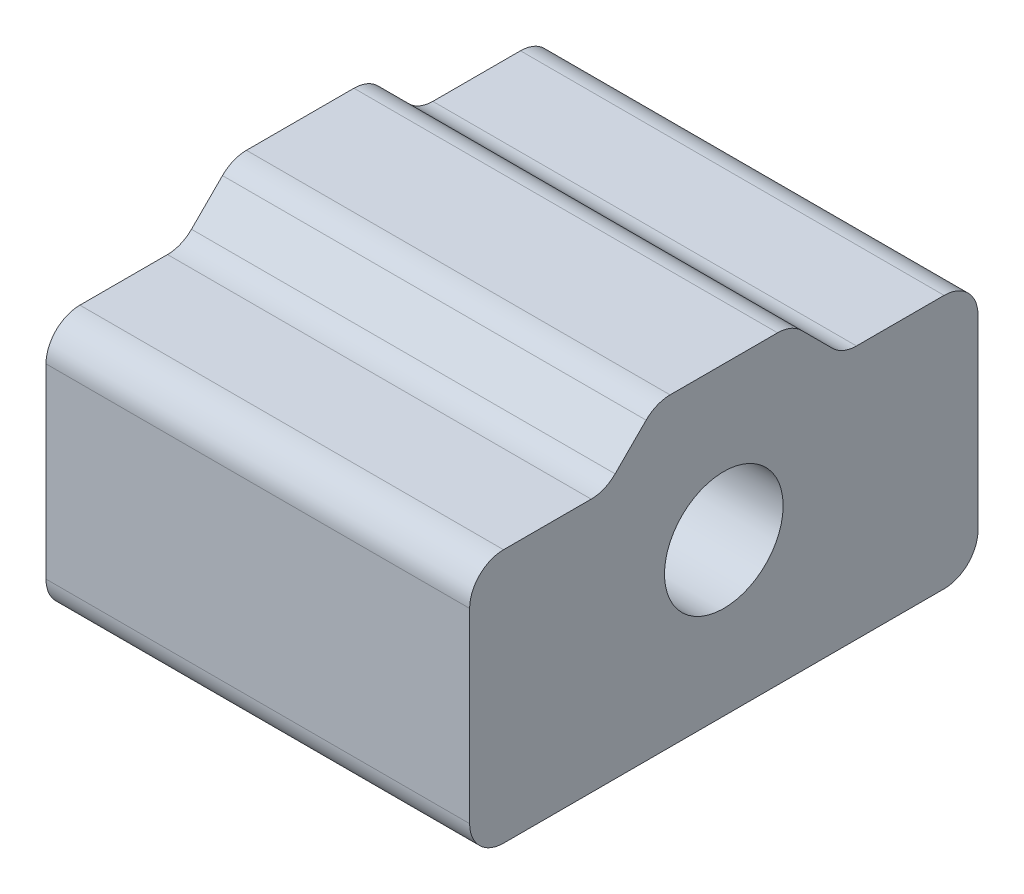
ISO-10303-21;
HEADER;
FILE_DESCRIPTION(('STEP AP214'),'2;1');
FILE_NAME('part.step','',(''),(''),'','','');
FILE_SCHEMA(('AUTOMOTIVE_DESIGN { 1 0 10303 214 1 1 1 1 }'));
ENDSEC;
DATA;
#1=APPLICATION_CONTEXT('core data for automotive mechanical design processes');
#2=APPLICATION_PROTOCOL_DEFINITION('international standard','automotive_design',2000,#1);
#3=PRODUCT_CONTEXT('',#1,'mechanical');
#4=PRODUCT('Part','Part','',(#3));
#5=PRODUCT_RELATED_PRODUCT_CATEGORY('part','',(#4));
#6=PRODUCT_DEFINITION_FORMATION('','',#4);
#7=PRODUCT_DEFINITION_CONTEXT('part definition',#1,'design');
#8=PRODUCT_DEFINITION('design','',#6,#7);
#9=PRODUCT_DEFINITION_SHAPE('','',#8);
#10=(LENGTH_UNIT() NAMED_UNIT(*) SI_UNIT(.MILLI.,.METRE.));
#11=(NAMED_UNIT(*) PLANE_ANGLE_UNIT() SI_UNIT($,.RADIAN.));
#12=(NAMED_UNIT(*) SI_UNIT($,.STERADIAN.) SOLID_ANGLE_UNIT());
#13=UNCERTAINTY_MEASURE_WITH_UNIT(LENGTH_MEASURE(1.E-05),#10,'distance_accuracy_value','');
#14=(GEOMETRIC_REPRESENTATION_CONTEXT(3) GLOBAL_UNCERTAINTY_ASSIGNED_CONTEXT((#13)) GLOBAL_UNIT_ASSIGNED_CONTEXT((#10,
#11,#12)) REPRESENTATION_CONTEXT('',''));
#15=CARTESIAN_POINT('',(0.,0.,0.));
#16=DIRECTION('',(0.,0.,1.));
#17=DIRECTION('',(1.,0.,0.));
#18=AXIS2_PLACEMENT_3D('',#15,#16,#17);
#19=CARTESIAN_POINT('',(-31.0580369710522,18.,-14.513593864228));
#20=DIRECTION('',(1.,0.,0.));
#21=DIRECTION('',(0.,0.,-1.));
#22=AXIS2_PLACEMENT_3D('',#19,#20,#21);
#23=PLANE('',#22);
#24=CARTESIAN_POINT('',(-31.0580369710522,9.,0.486406135772036));
#25=DIRECTION('',(1.,0.,0.));
#26=DIRECTION('',(0.,0.,-1.));
#27=AXIS2_PLACEMENT_3D('',#24,#25,#26);
#28=CIRCLE('',#27,3.5);
#29=CARTESIAN_POINT('',(-31.0580369710522,9.,-3.01359386422796));
#30=VERTEX_POINT('',#29);
#31=EDGE_CURVE('E326',#30,#30,#28,.T.);
#32=ORIENTED_EDGE('',*,*,#31,.T.);
#33=EDGE_LOOP('',(#32));
#34=FACE_BOUND('',#33,.T.);
#35=DIRECTION('',(0.,0.707106781186549,-0.707106781186546));
#36=VECTOR('',#35,1.);
#37=CARTESIAN_POINT('',(-31.0580369710522,27.5,-5.01359386422793));
#38=LINE('',#37,#36);
#39=CARTESIAN_POINT('',(-31.0580369710522,15.5857864376269,6.90061969814513));
#40=VERTEX_POINT('',#39);
#41=CARTESIAN_POINT('',(-31.0580369710522,17.4142135623731,5.07219257339895));
#42=VERTEX_POINT('',#41);
#43=EDGE_CURVE('E176',#40,#42,#38,.T.);
#44=ORIENTED_EDGE('',*,*,#43,.T.);
#45=CARTESIAN_POINT('',(-31.0580369710522,16.,3.65797901102585));
#46=DIRECTION('',(1.,0.,0.));
#47=DIRECTION('',(0.,0.,-1.));
#48=AXIS2_PLACEMENT_3D('',#45,#46,#47);
#49=CIRCLE('',#48,2.);
#50=CARTESIAN_POINT('',(-31.0580369710522,18.,3.65797901102585));
#51=VERTEX_POINT('',#50);
#52=EDGE_CURVE('E245',#42,#51,#49,.F.);
#53=ORIENTED_EDGE('',*,*,#52,.T.);
#54=DIRECTION('',(0.,0.,1.));
#55=VECTOR('',#54,1.);
#56=CARTESIAN_POINT('',(-31.0580369710522,18.,-14.513593864228));
#57=LINE('',#56,#55);
#58=CARTESIAN_POINT('',(-31.0580369710522,18.,-2.68516673948174));
#59=VERTEX_POINT('',#58);
#60=EDGE_CURVE('E200',#59,#51,#57,.T.);
#61=ORIENTED_EDGE('',*,*,#60,.F.);
#62=CARTESIAN_POINT('',(-31.0580369710522,16.,-2.68516673948174));
#63=DIRECTION('',(1.,0.,0.));
#64=DIRECTION('',(0.,0.,-1.));
#65=AXIS2_PLACEMENT_3D('',#62,#63,#64);
#66=CIRCLE('',#65,2.);
#67=CARTESIAN_POINT('',(-31.0580369710522,17.4142135623731,-4.09938030185483));
#68=VERTEX_POINT('',#67);
#69=EDGE_CURVE('E230',#59,#68,#66,.F.);
#70=ORIENTED_EDGE('',*,*,#69,.T.);
#71=DIRECTION('',(0.,-0.707106781186544,-0.707106781186551));
#72=VECTOR('',#71,1.);
#73=CARTESIAN_POINT('',(-31.0580369710522,12.5,-9.013593864228));
#74=LINE('',#73,#72);
#75=CARTESIAN_POINT('',(-31.0580369710522,15.5857864376269,-5.92780742660106));
#76=VERTEX_POINT('',#75);
#77=EDGE_CURVE('E334',#68,#76,#74,.T.);
#78=ORIENTED_EDGE('',*,*,#77,.T.);
#79=CARTESIAN_POINT('',(-31.0580369710522,17.,-7.34202098897415));
#80=DIRECTION('',(1.,0.,0.));
#81=DIRECTION('',(0.,0.,-1.));
#82=AXIS2_PLACEMENT_3D('',#79,#80,#81);
#83=CIRCLE('',#82,2.);
#84=CARTESIAN_POINT('',(-31.0580369710522,15.,-7.34202098897415));
#85=VERTEX_POINT('',#84);
#86=EDGE_CURVE('E11',#76,#85,#83,.T.);
#87=ORIENTED_EDGE('',*,*,#86,.T.);
#88=DIRECTION('',(0.,0.,-1.));
#89=VECTOR('',#88,1.);
#90=CARTESIAN_POINT('',(-31.0580369710522,15.,-14.513593864228));
#91=LINE('',#90,#89);
#92=CARTESIAN_POINT('',(-31.0580369710522,15.,-12.513593864228));
#93=VERTEX_POINT('',#92);
#94=EDGE_CURVE('E192',#85,#93,#91,.T.);
#95=ORIENTED_EDGE('',*,*,#94,.T.);
#96=CARTESIAN_POINT('',(-31.0580369710522,13.,-12.513593864228));
#97=DIRECTION('',(1.,0.,0.));
#98=DIRECTION('',(0.,0.,-1.));
#99=AXIS2_PLACEMENT_3D('',#96,#97,#98);
#100=CIRCLE('',#99,2.);
#101=CARTESIAN_POINT('',(-31.0580369710522,13.,-14.513593864228));
#102=VERTEX_POINT('',#101);
#103=EDGE_CURVE('E233',#93,#102,#100,.F.);
#104=ORIENTED_EDGE('',*,*,#103,.T.);
#105=DIRECTION('',(0.,-1.,0.));
#106=VECTOR('',#105,1.);
#107=CARTESIAN_POINT('',(-31.0580369710522,18.,-14.513593864228));
#108=LINE('',#107,#106);
#109=CARTESIAN_POINT('',(-31.0580369710522,2.,-14.513593864228));
#110=VERTEX_POINT('',#109);
#111=EDGE_CURVE('E209',#102,#110,#108,.T.);
#112=ORIENTED_EDGE('',*,*,#111,.T.);
#113=CARTESIAN_POINT('',(-31.0580369710522,2.,-12.513593864228));
#114=DIRECTION('',(1.,0.,0.));
#115=DIRECTION('',(0.,0.,-1.));
#116=AXIS2_PLACEMENT_3D('',#113,#114,#115);
#117=CIRCLE('',#116,2.);
#118=CARTESIAN_POINT('',(-31.0580369710522,0.,-12.513593864228));
#119=VERTEX_POINT('',#118);
#120=EDGE_CURVE('E236',#110,#119,#117,.F.);
#121=ORIENTED_EDGE('',*,*,#120,.T.);
#122=DIRECTION('',(0.,0.,1.));
#123=VECTOR('',#122,1.);
#124=CARTESIAN_POINT('',(-31.0580369710522,0.,-14.513593864228));
#125=LINE('',#124,#123);
#126=CARTESIAN_POINT('',(-31.0580369710522,0.,13.486406135772));
#127=VERTEX_POINT('',#126);
#128=EDGE_CURVE('E199',#119,#127,#125,.T.);
#129=ORIENTED_EDGE('',*,*,#128,.T.);
#130=CARTESIAN_POINT('',(-31.0580369710522,2.,13.486406135772));
#131=DIRECTION('',(1.,0.,0.));
#132=DIRECTION('',(0.,0.,-1.));
#133=AXIS2_PLACEMENT_3D('',#130,#131,#132);
#134=CIRCLE('',#133,2.);
#135=CARTESIAN_POINT('',(-31.0580369710522,2.,15.486406135772));
#136=VERTEX_POINT('',#135);
#137=EDGE_CURVE('E239',#127,#136,#134,.F.);
#138=ORIENTED_EDGE('',*,*,#137,.T.);
#139=DIRECTION('',(0.,-1.,0.));
#140=VECTOR('',#139,1.);
#141=CARTESIAN_POINT('',(-31.0580369710522,18.,15.486406135772));
#142=LINE('',#141,#140);
#143=CARTESIAN_POINT('',(-31.0580369710522,13.,15.486406135772));
#144=VERTEX_POINT('',#143);
#145=EDGE_CURVE('E179',#144,#136,#142,.T.);
#146=ORIENTED_EDGE('',*,*,#145,.F.);
#147=CARTESIAN_POINT('',(-31.0580369710522,13.,13.486406135772));
#148=DIRECTION('',(1.,0.,0.));
#149=DIRECTION('',(0.,0.,-1.));
#150=AXIS2_PLACEMENT_3D('',#147,#148,#149);
#151=CIRCLE('',#150,2.);
#152=CARTESIAN_POINT('',(-31.0580369710522,15.,13.486406135772));
#153=VERTEX_POINT('',#152);
#154=EDGE_CURVE('E242',#144,#153,#151,.F.);
#155=ORIENTED_EDGE('',*,*,#154,.T.);
#156=DIRECTION('',(0.,0.,-1.));
#157=VECTOR('',#156,1.);
#158=CARTESIAN_POINT('',(-31.0580369710522,15.,-14.513593864228));
#159=LINE('',#158,#157);
#160=CARTESIAN_POINT('',(-31.0580369710522,15.,8.31483326051823));
#161=VERTEX_POINT('',#160);
#162=EDGE_CURVE('E190',#153,#161,#159,.T.);
#163=ORIENTED_EDGE('',*,*,#162,.T.);
#164=CARTESIAN_POINT('',(-31.0580369710522,17.,8.31483326051823));
#165=DIRECTION('',(1.,0.,0.));
#166=DIRECTION('',(0.,0.,-1.));
#167=AXIS2_PLACEMENT_3D('',#164,#165,#166);
#168=CIRCLE('',#167,2.);
#169=EDGE_CURVE('E165',#161,#40,#168,.T.);
#170=ORIENTED_EDGE('',*,*,#169,.T.);
#171=EDGE_LOOP('',(#44,#53,#61,#70,#78,#87,#95,#104,#112,#121,#129,#138,#146,#155,#163,#170));
#172=FACE_BOUND('',#171,.T.);
#173=ADVANCED_FACE('F41',(#34,#172),#23,.F.);
#174=CARTESIAN_POINT('',(-31.0580369710522,18.,15.486406135772));
#175=DIRECTION('',(0.,0.,-1.));
#176=DIRECTION('',(-1.,0.,0.));
#177=AXIS2_PLACEMENT_3D('',#174,#175,#176);
#178=PLANE('',#177);
#179=DIRECTION('',(0.,-1.,0.));
#180=VECTOR('',#179,1.);
#181=CARTESIAN_POINT('',(-6.05803697105218,18.,15.486406135772));
#182=LINE('',#181,#180);
#183=CARTESIAN_POINT('',(-6.05803697105218,13.,15.486406135772));
#184=VERTEX_POINT('',#183);
#185=CARTESIAN_POINT('',(-6.05803697105218,2.,15.486406135772));
#186=VERTEX_POINT('',#185);
#187=EDGE_CURVE('E222',#184,#186,#182,.T.);
#188=ORIENTED_EDGE('',*,*,#187,.F.);
#189=DIRECTION('',(1.,0.,0.));
#190=VECTOR('',#189,1.);
#191=CARTESIAN_POINT('',(-31.0580369710522,13.,15.486406135772));
#192=LINE('',#191,#190);
#193=EDGE_CURVE('E280',#184,#144,#192,.F.);
#194=ORIENTED_EDGE('',*,*,#193,.T.);
#195=ORIENTED_EDGE('',*,*,#145,.T.);
#196=DIRECTION('',(1.,0.,0.));
#197=VECTOR('',#196,1.);
#198=CARTESIAN_POINT('',(-31.0580369710522,2.,15.486406135772));
#199=LINE('',#198,#197);
#200=EDGE_CURVE('E276',#136,#186,#199,.T.);
#201=ORIENTED_EDGE('',*,*,#200,.T.);
#202=EDGE_LOOP('',(#188,#194,#195,#201));
#203=FACE_BOUND('',#202,.T.);
#204=ADVANCED_FACE('F411',(#203),#178,.F.);
#205=CARTESIAN_POINT('',(-6.05803697105218,18.,-14.513593864228));
#206=DIRECTION('',(-1.,0.,0.));
#207=DIRECTION('',(0.,0.,1.));
#208=AXIS2_PLACEMENT_3D('',#205,#206,#207);
#209=PLANE('',#208);
#210=CARTESIAN_POINT('',(-6.05803697105218,9.,0.486406135772033));
#211=DIRECTION('',(1.,0.,0.));
#212=DIRECTION('',(0.,0.,-1.));
#213=AXIS2_PLACEMENT_3D('',#210,#211,#212);
#214=CIRCLE('',#213,3.5);
#215=CARTESIAN_POINT('',(-6.05803697105218,9.,-3.01359386422796));
#216=VERTEX_POINT('',#215);
#217=EDGE_CURVE('E347',#216,#216,#214,.T.);
#218=ORIENTED_EDGE('',*,*,#217,.F.);
#219=EDGE_LOOP('',(#218));
#220=FACE_BOUND('',#219,.T.);
#221=DIRECTION('',(0.,0.,-1.));
#222=VECTOR('',#221,1.);
#223=CARTESIAN_POINT('',(-6.05803697105218,18.,-14.513593864228));
#224=LINE('',#223,#222);
#225=CARTESIAN_POINT('',(-6.05803697105218,18.,3.65797901102585));
#226=VERTEX_POINT('',#225);
#227=CARTESIAN_POINT('',(-6.05803697105218,18.,-2.68516673948175));
#228=VERTEX_POINT('',#227);
#229=EDGE_CURVE('E204',#226,#228,#224,.T.);
#230=ORIENTED_EDGE('',*,*,#229,.F.);
#231=CARTESIAN_POINT('',(-6.05803697105218,16.,3.65797901102585));
#232=DIRECTION('',(-1.,0.,0.));
#233=DIRECTION('',(0.,0.,1.));
#234=AXIS2_PLACEMENT_3D('',#231,#232,#233);
#235=CIRCLE('',#234,2.);
#236=CARTESIAN_POINT('',(-6.05803697105218,17.4142135623731,5.07219257339895));
#237=VERTEX_POINT('',#236);
#238=EDGE_CURVE('E184',#226,#237,#235,.F.);
#239=ORIENTED_EDGE('',*,*,#238,.T.);
#240=DIRECTION('',(0.,0.707106781186549,-0.707106781186546));
#241=VECTOR('',#240,1.);
#242=CARTESIAN_POINT('',(-6.05803697105218,11.243203067886,11.243203067886));
#243=LINE('',#242,#241);
#244=CARTESIAN_POINT('',(-6.05803697105218,15.5857864376269,6.90061969814513));
#245=VERTEX_POINT('',#244);
#246=EDGE_CURVE('E173',#245,#237,#243,.T.);
#247=ORIENTED_EDGE('',*,*,#246,.F.);
#248=CARTESIAN_POINT('',(-6.05803697105218,17.,8.31483326051823));
#249=DIRECTION('',(-1.,0.,0.));
#250=DIRECTION('',(0.,0.,1.));
#251=AXIS2_PLACEMENT_3D('',#248,#249,#250);
#252=CIRCLE('',#251,2.);
#253=CARTESIAN_POINT('',(-6.05803697105218,15.,8.31483326051823));
#254=VERTEX_POINT('',#253);
#255=EDGE_CURVE('E155',#245,#254,#252,.T.);
#256=ORIENTED_EDGE('',*,*,#255,.T.);
#257=DIRECTION('',(0.,0.,-1.));
#258=VECTOR('',#257,1.);
#259=CARTESIAN_POINT('',(-6.05803697105218,15.,0.));
#260=LINE('',#259,#258);
#261=CARTESIAN_POINT('',(-6.05803697105218,15.,13.486406135772));
#262=VERTEX_POINT('',#261);
#263=EDGE_CURVE('E186',#262,#254,#260,.T.);
#264=ORIENTED_EDGE('',*,*,#263,.F.);
#265=CARTESIAN_POINT('',(-6.05803697105218,13.,13.486406135772));
#266=DIRECTION('',(-1.,0.,0.));
#267=DIRECTION('',(0.,0.,1.));
#268=AXIS2_PLACEMENT_3D('',#265,#266,#267);
#269=CIRCLE('',#268,2.);
#270=EDGE_CURVE('E265',#262,#184,#269,.F.);
#271=ORIENTED_EDGE('',*,*,#270,.T.);
#272=ORIENTED_EDGE('',*,*,#187,.T.);
#273=CARTESIAN_POINT('',(-6.05803697105218,2.,13.486406135772));
#274=DIRECTION('',(-1.,0.,0.));
#275=DIRECTION('',(0.,0.,1.));
#276=AXIS2_PLACEMENT_3D('',#273,#274,#275);
#277=CIRCLE('',#276,2.);
#278=CARTESIAN_POINT('',(-6.05803697105218,0.,13.486406135772));
#279=VERTEX_POINT('',#278);
#280=EDGE_CURVE('E64',#186,#279,#277,.F.);
#281=ORIENTED_EDGE('',*,*,#280,.T.);
#282=DIRECTION('',(0.,0.,-1.));
#283=VECTOR('',#282,1.);
#284=CARTESIAN_POINT('',(-6.05803697105218,0.,-14.513593864228));
#285=LINE('',#284,#283);
#286=CARTESIAN_POINT('',(-6.05803697105218,0.,-12.513593864228));
#287=VERTEX_POINT('',#286);
#288=EDGE_CURVE('E205',#279,#287,#285,.T.);
#289=ORIENTED_EDGE('',*,*,#288,.T.);
#290=CARTESIAN_POINT('',(-6.05803697105218,2.,-12.513593864228));
#291=DIRECTION('',(-1.,0.,0.));
#292=DIRECTION('',(0.,0.,1.));
#293=AXIS2_PLACEMENT_3D('',#290,#291,#292);
#294=CIRCLE('',#293,2.);
#295=CARTESIAN_POINT('',(-6.05803697105218,2.,-14.513593864228));
#296=VERTEX_POINT('',#295);
#297=EDGE_CURVE('E260',#287,#296,#294,.F.);
#298=ORIENTED_EDGE('',*,*,#297,.T.);
#299=DIRECTION('',(0.,-1.,0.));
#300=VECTOR('',#299,1.);
#301=CARTESIAN_POINT('',(-6.05803697105218,18.,-14.513593864228));
#302=LINE('',#301,#300);
#303=CARTESIAN_POINT('',(-6.05803697105218,13.,-14.513593864228));
#304=VERTEX_POINT('',#303);
#305=EDGE_CURVE('E218',#304,#296,#302,.T.);
#306=ORIENTED_EDGE('',*,*,#305,.F.);
#307=CARTESIAN_POINT('',(-6.05803697105218,13.,-12.513593864228));
#308=DIRECTION('',(-1.,0.,0.));
#309=DIRECTION('',(0.,0.,1.));
#310=AXIS2_PLACEMENT_3D('',#307,#308,#309);
#311=CIRCLE('',#310,2.);
#312=CARTESIAN_POINT('',(-6.05803697105218,15.,-12.513593864228));
#313=VERTEX_POINT('',#312);
#314=EDGE_CURVE('E257',#304,#313,#311,.F.);
#315=ORIENTED_EDGE('',*,*,#314,.T.);
#316=DIRECTION('',(0.,0.,-1.));
#317=VECTOR('',#316,1.);
#318=CARTESIAN_POINT('',(-6.05803697105218,15.,-14.513593864228));
#319=LINE('',#318,#317);
#320=CARTESIAN_POINT('',(-6.05803697105218,15.,-7.34202098897415));
#321=VERTEX_POINT('',#320);
#322=EDGE_CURVE('E316',#321,#313,#319,.T.);
#323=ORIENTED_EDGE('',*,*,#322,.F.);
#324=CARTESIAN_POINT('',(-6.05803697105219,17.,-7.34202098897415));
#325=DIRECTION('',(-1.,0.,0.));
#326=DIRECTION('',(0.,0.,1.));
#327=AXIS2_PLACEMENT_3D('',#324,#325,#326);
#328=CIRCLE('',#327,2.);
#329=CARTESIAN_POINT('',(-6.05803697105218,15.5857864376269,-5.92780742660106));
#330=VERTEX_POINT('',#329);
#331=EDGE_CURVE('E50',#321,#330,#328,.T.);
#332=ORIENTED_EDGE('',*,*,#331,.T.);
#333=DIRECTION('',(0.,-0.707106781186544,-0.707106781186551));
#334=VECTOR('',#333,1.);
#335=CARTESIAN_POINT('',(-6.05803697105218,18.,-3.51359386422793));
#336=LINE('',#335,#334);
#337=CARTESIAN_POINT('',(-6.05803697105218,17.4142135623731,-4.09938030185483));
#338=VERTEX_POINT('',#337);
#339=EDGE_CURVE('E314',#338,#330,#336,.T.);
#340=ORIENTED_EDGE('',*,*,#339,.F.);
#341=CARTESIAN_POINT('',(-6.05803697105218,16.,-2.68516673948175));
#342=DIRECTION('',(-1.,0.,0.));
#343=DIRECTION('',(0.,0.,1.));
#344=AXIS2_PLACEMENT_3D('',#341,#342,#343);
#345=CIRCLE('',#344,2.);
#346=EDGE_CURVE('E254',#338,#228,#345,.F.);
#347=ORIENTED_EDGE('',*,*,#346,.T.);
#348=EDGE_LOOP('',(#230,#239,#247,#256,#264,#271,#272,#281,#289,#298,#306,#315,#323,#332,#340,#347));
#349=FACE_BOUND('',#348,.T.);
#350=ADVANCED_FACE('F182',(#220,#349),#209,.F.);
#351=CARTESIAN_POINT('',(-31.0580369710522,18.,-14.513593864228));
#352=DIRECTION('',(0.,0.,1.));
#353=DIRECTION('',(1.,0.,0.));
#354=AXIS2_PLACEMENT_3D('',#351,#352,#353);
#355=PLANE('',#354);
#356=ORIENTED_EDGE('',*,*,#305,.T.);
#357=DIRECTION('',(-1.,0.,0.));
#358=VECTOR('',#357,1.);
#359=CARTESIAN_POINT('',(-31.0580369710522,2.,-14.513593864228));
#360=LINE('',#359,#358);
#361=EDGE_CURVE('E292',#296,#110,#360,.T.);
#362=ORIENTED_EDGE('',*,*,#361,.T.);
#363=ORIENTED_EDGE('',*,*,#111,.F.);
#364=DIRECTION('',(1.,0.,0.));
#365=VECTOR('',#364,1.);
#366=CARTESIAN_POINT('',(-31.0580369710522,13.,-14.513593864228));
#367=LINE('',#366,#365);
#368=EDGE_CURVE('E288',#102,#304,#367,.T.);
#369=ORIENTED_EDGE('',*,*,#368,.T.);
#370=EDGE_LOOP('',(#356,#362,#363,#369));
#371=FACE_BOUND('',#370,.T.);
#372=ADVANCED_FACE('F465',(#371),#355,.F.);
#373=CARTESIAN_POINT('',(0.,18.,0.));
#374=DIRECTION('',(0.,1.,0.));
#375=DIRECTION('',(0.,0.,1.));
#376=AXIS2_PLACEMENT_3D('',#373,#374,#375);
#377=PLANE('',#376);
#378=ORIENTED_EDGE('',*,*,#60,.T.);
#379=DIRECTION('',(-1.,0.,0.));
#380=VECTOR('',#379,1.);
#381=CARTESIAN_POINT('',(-6.05803697105218,18.,3.65797901102585));
#382=LINE('',#381,#380);
#383=EDGE_CURVE('E251',#51,#226,#382,.F.);
#384=ORIENTED_EDGE('',*,*,#383,.T.);
#385=ORIENTED_EDGE('',*,*,#229,.T.);
#386=DIRECTION('',(1.,0.,0.));
#387=VECTOR('',#386,1.);
#388=CARTESIAN_POINT('',(-31.0580369710522,18.,-2.68516673948174));
#389=LINE('',#388,#387);
#390=EDGE_CURVE('E248',#228,#59,#389,.F.);
#391=ORIENTED_EDGE('',*,*,#390,.T.);
#392=EDGE_LOOP('',(#378,#384,#385,#391));
#393=FACE_BOUND('',#392,.T.);
#394=ADVANCED_FACE('F397',(#393),#377,.T.);
#395=CARTESIAN_POINT('',(0.,0.,0.));
#396=DIRECTION('',(0.,1.,0.));
#397=DIRECTION('',(0.,0.,1.));
#398=AXIS2_PLACEMENT_3D('',#395,#396,#397);
#399=PLANE('',#398);
#400=CARTESIAN_POINT('',(-11.0580369710522,0.,-9.51359386422797));
#401=DIRECTION('',(0.,-1.,0.));
#402=DIRECTION('',(0.,0.,-1.));
#403=AXIS2_PLACEMENT_3D('',#400,#401,#402);
#404=CIRCLE('',#403,2.);
#405=CARTESIAN_POINT('',(-11.0580369710522,0.,-11.513593864228));
#406=VERTEX_POINT('',#405);
#407=EDGE_CURVE('E369',#406,#406,#404,.T.);
#408=ORIENTED_EDGE('',*,*,#407,.F.);
#409=EDGE_LOOP('',(#408));
#410=FACE_BOUND('',#409,.T.);
#411=CARTESIAN_POINT('',(-26.0580369710522,0.,10.486406135772));
#412=DIRECTION('',(0.,-1.,0.));
#413=DIRECTION('',(0.,0.,-1.));
#414=AXIS2_PLACEMENT_3D('',#411,#412,#413);
#415=CIRCLE('',#414,2.);
#416=CARTESIAN_POINT('',(-26.0580369710522,0.,8.48640613577203));
#417=VERTEX_POINT('',#416);
#418=EDGE_CURVE('E360',#417,#417,#415,.T.);
#419=ORIENTED_EDGE('',*,*,#418,.F.);
#420=EDGE_LOOP('',(#419));
#421=FACE_BOUND('',#420,.T.);
#422=CARTESIAN_POINT('',(-26.0580369710522,0.,-9.51359386422797));
#423=DIRECTION('',(0.,-1.,0.));
#424=DIRECTION('',(0.,0.,-1.));
#425=AXIS2_PLACEMENT_3D('',#422,#423,#424);
#426=CIRCLE('',#425,2.);
#427=CARTESIAN_POINT('',(-26.0580369710522,0.,-11.513593864228));
#428=VERTEX_POINT('',#427);
#429=EDGE_CURVE('E376',#428,#428,#426,.T.);
#430=ORIENTED_EDGE('',*,*,#429,.F.);
#431=EDGE_LOOP('',(#430));
#432=FACE_BOUND('',#431,.T.);
#433=CARTESIAN_POINT('',(-11.0580369710522,0.,10.486406135772));
#434=DIRECTION('',(0.,-1.,0.));
#435=DIRECTION('',(0.,0.,-1.));
#436=AXIS2_PLACEMENT_3D('',#433,#434,#435);
#437=CIRCLE('',#436,2.);
#438=CARTESIAN_POINT('',(-11.0580369710522,0.,8.48640613577203));
#439=VERTEX_POINT('',#438);
#440=EDGE_CURVE('E352',#439,#439,#437,.T.);
#441=ORIENTED_EDGE('',*,*,#440,.F.);
#442=EDGE_LOOP('',(#441));
#443=FACE_BOUND('',#442,.T.);
#444=ORIENTED_EDGE('',*,*,#288,.F.);
#445=DIRECTION('',(1.,0.,0.));
#446=VECTOR('',#445,1.);
#447=CARTESIAN_POINT('',(0.,0.,13.486406135772));
#448=LINE('',#447,#446);
#449=EDGE_CURVE('E285',#279,#127,#448,.F.);
#450=ORIENTED_EDGE('',*,*,#449,.T.);
#451=ORIENTED_EDGE('',*,*,#128,.F.);
#452=DIRECTION('',(-1.,0.,0.));
#453=VECTOR('',#452,1.);
#454=CARTESIAN_POINT('',(0.,0.,-12.513593864228));
#455=LINE('',#454,#453);
#456=EDGE_CURVE('E57',#119,#287,#455,.F.);
#457=ORIENTED_EDGE('',*,*,#456,.T.);
#458=EDGE_LOOP('',(#444,#450,#451,#457));
#459=FACE_BOUND('',#458,.T.);
#460=ADVANCED_FACE('F393',(#410,#421,#432,#443,#459),#399,.F.);
#461=CARTESIAN_POINT('',(-39.0580369710522,15.,0.));
#462=DIRECTION('',(0.,-1.,0.));
#463=DIRECTION('',(0.,0.,-1.));
#464=AXIS2_PLACEMENT_3D('',#461,#462,#463);
#465=PLANE('',#464);
#466=ORIENTED_EDGE('',*,*,#263,.T.);
#467=DIRECTION('',(1.,0.,0.));
#468=VECTOR('',#467,1.);
#469=CARTESIAN_POINT('',(-31.0580369710522,15.,8.31483326051823));
#470=LINE('',#469,#468);
#471=EDGE_CURVE('E160',#254,#161,#470,.F.);
#472=ORIENTED_EDGE('',*,*,#471,.T.);
#473=ORIENTED_EDGE('',*,*,#162,.F.);
#474=DIRECTION('',(1.,0.,0.));
#475=VECTOR('',#474,1.);
#476=CARTESIAN_POINT('',(-39.0580369710522,15.,13.486406135772));
#477=LINE('',#476,#475);
#478=EDGE_CURVE('E270',#153,#262,#477,.T.);
#479=ORIENTED_EDGE('',*,*,#478,.T.);
#480=EDGE_LOOP('',(#466,#472,#473,#479));
#481=FACE_BOUND('',#480,.T.);
#482=ADVANCED_FACE('F396',(#481),#465,.F.);
#483=CARTESIAN_POINT('',(-39.0580369710522,11.243203067886,11.243203067886));
#484=DIRECTION('',(0.,-0.707106781186546,-0.707106781186549));
#485=DIRECTION('',(0.,0.707106781186549,-0.707106781186546));
#486=AXIS2_PLACEMENT_3D('',#483,#484,#485);
#487=PLANE('',#486);
#488=ORIENTED_EDGE('',*,*,#246,.T.);
#489=DIRECTION('',(-1.,0.,0.));
#490=VECTOR('',#489,1.);
#491=CARTESIAN_POINT('',(-31.0580369710522,17.4142135623731,5.07219257339895));
#492=LINE('',#491,#490);
#493=EDGE_CURVE('E178',#237,#42,#492,.T.);
#494=ORIENTED_EDGE('',*,*,#493,.T.);
#495=ORIENTED_EDGE('',*,*,#43,.F.);
#496=DIRECTION('',(1.,0.,0.));
#497=VECTOR('',#496,1.);
#498=CARTESIAN_POINT('',(-6.05803697105218,15.5857864376269,6.90061969814513));
#499=LINE('',#498,#497);
#500=EDGE_CURVE('E159',#40,#245,#499,.T.);
#501=ORIENTED_EDGE('',*,*,#500,.T.);
#502=EDGE_LOOP('',(#488,#494,#495,#501));
#503=FACE_BOUND('',#502,.T.);
#504=ADVANCED_FACE('F171',(#503),#487,.F.);
#505=CARTESIAN_POINT('',(-39.0580369710522,15.,-14.513593864228));
#506=DIRECTION('',(0.,-1.,0.));
#507=DIRECTION('',(0.,0.,-1.));
#508=AXIS2_PLACEMENT_3D('',#505,#506,#507);
#509=PLANE('',#508);
#510=ORIENTED_EDGE('',*,*,#322,.T.);
#511=DIRECTION('',(1.,0.,0.));
#512=VECTOR('',#511,1.);
#513=CARTESIAN_POINT('',(-39.0580369710522,15.,-12.513593864228));
#514=LINE('',#513,#512);
#515=EDGE_CURVE('E300',#313,#93,#514,.F.);
#516=ORIENTED_EDGE('',*,*,#515,.T.);
#517=ORIENTED_EDGE('',*,*,#94,.F.);
#518=DIRECTION('',(1.,0.,0.));
#519=VECTOR('',#518,1.);
#520=CARTESIAN_POINT('',(-6.05803697105218,15.,-7.34202098897415));
#521=LINE('',#520,#519);
#522=EDGE_CURVE('E296',#85,#321,#521,.T.);
#523=ORIENTED_EDGE('',*,*,#522,.T.);
#524=EDGE_LOOP('',(#510,#516,#517,#523));
#525=FACE_BOUND('',#524,.T.);
#526=ADVANCED_FACE('F336',(#525),#509,.F.);
#527=CARTESIAN_POINT('',(-39.0580369710522,18.,-3.51359386422793));
#528=DIRECTION('',(0.,-0.707106781186551,0.707106781186544));
#529=DIRECTION('',(0.,-0.707106781186544,-0.707106781186551));
#530=AXIS2_PLACEMENT_3D('',#527,#528,#529);
#531=PLANE('',#530);
#532=ORIENTED_EDGE('',*,*,#339,.T.);
#533=DIRECTION('',(1.,0.,0.));
#534=VECTOR('',#533,1.);
#535=CARTESIAN_POINT('',(-31.0580369710522,15.5857864376269,-5.92780742660106));
#536=LINE('',#535,#534);
#537=EDGE_CURVE('E166',#330,#76,#536,.F.);
#538=ORIENTED_EDGE('',*,*,#537,.T.);
#539=ORIENTED_EDGE('',*,*,#77,.F.);
#540=DIRECTION('',(1.,0.,0.));
#541=VECTOR('',#540,1.);
#542=CARTESIAN_POINT('',(-6.05803697105218,17.4142135623731,-4.09938030185484));
#543=LINE('',#542,#541);
#544=EDGE_CURVE('E303',#68,#338,#543,.T.);
#545=ORIENTED_EDGE('',*,*,#544,.T.);
#546=EDGE_LOOP('',(#532,#538,#539,#545));
#547=FACE_BOUND('',#546,.T.);
#548=ADVANCED_FACE('F321',(#547),#531,.F.);
#549=CARTESIAN_POINT('',(-39.0580369710522,9.,0.486406135772037));
#550=DIRECTION('',(1.,0.,0.));
#551=DIRECTION('',(0.,0.,-1.));
#552=AXIS2_PLACEMENT_3D('',#549,#550,#551);
#553=CYLINDRICAL_SURFACE('',#552,3.5);
#554=ORIENTED_EDGE('',*,*,#217,.T.);
#555=EDGE_LOOP('',(#554));
#556=FACE_BOUND('',#555,.T.);
#557=ORIENTED_EDGE('',*,*,#31,.F.);
#558=EDGE_LOOP('',(#557));
#559=FACE_BOUND('',#558,.T.);
#560=ADVANCED_FACE('F477',(#556,#559),#553,.F.);
#561=CARTESIAN_POINT('',(-11.0580369710522,6.,10.486406135772));
#562=DIRECTION('',(0.,-1.,0.));
#563=DIRECTION('',(0.,0.,-1.));
#564=AXIS2_PLACEMENT_3D('',#561,#562,#563);
#565=CYLINDRICAL_SURFACE('',#564,2.);
#566=CARTESIAN_POINT('',(-11.0580369710522,6.,10.486406135772));
#567=DIRECTION('',(0.,-1.,0.));
#568=DIRECTION('',(0.,0.,-1.));
#569=AXIS2_PLACEMENT_3D('',#566,#567,#568);
#570=CIRCLE('',#569,2.);
#571=CARTESIAN_POINT('',(-11.0580369710522,6.,8.48640613577203));
#572=VERTEX_POINT('',#571);
#573=EDGE_CURVE('E351',#572,#572,#570,.T.);
#574=ORIENTED_EDGE('',*,*,#573,.F.);
#575=EDGE_LOOP('',(#574));
#576=FACE_BOUND('',#575,.T.);
#577=ORIENTED_EDGE('',*,*,#440,.T.);
#578=EDGE_LOOP('',(#577));
#579=FACE_BOUND('',#578,.T.);
#580=ADVANCED_FACE('F480',(#576,#579),#565,.F.);
#581=CARTESIAN_POINT('',(-11.0580369710522,6.,10.486406135772));
#582=DIRECTION('',(0.,-1.,0.));
#583=DIRECTION('',(0.,0.,-1.));
#584=AXIS2_PLACEMENT_3D('',#581,#582,#583);
#585=PLANE('',#584);
#586=ORIENTED_EDGE('',*,*,#573,.T.);
#587=EDGE_LOOP('',(#586));
#588=FACE_BOUND('',#587,.T.);
#589=ADVANCED_FACE('F389',(#588),#585,.T.);
#590=CARTESIAN_POINT('',(-26.0580369710522,6.,-9.51359386422797));
#591=DIRECTION('',(0.,-1.,0.));
#592=DIRECTION('',(0.,0.,-1.));
#593=AXIS2_PLACEMENT_3D('',#590,#591,#592);
#594=CYLINDRICAL_SURFACE('',#593,2.);
#595=CARTESIAN_POINT('',(-26.0580369710522,6.,-9.51359386422797));
#596=DIRECTION('',(0.,-1.,0.));
#597=DIRECTION('',(0.,0.,-1.));
#598=AXIS2_PLACEMENT_3D('',#595,#596,#597);
#599=CIRCLE('',#598,2.);
#600=CARTESIAN_POINT('',(-26.0580369710522,6.,-11.513593864228));
#601=VERTEX_POINT('',#600);
#602=EDGE_CURVE('E365',#601,#601,#599,.T.);
#603=ORIENTED_EDGE('',*,*,#602,.F.);
#604=EDGE_LOOP('',(#603));
#605=FACE_BOUND('',#604,.T.);
#606=ORIENTED_EDGE('',*,*,#429,.T.);
#607=EDGE_LOOP('',(#606));
#608=FACE_BOUND('',#607,.T.);
#609=ADVANCED_FACE('F386',(#605,#608),#594,.F.);
#610=CARTESIAN_POINT('',(-26.0580369710522,6.,-9.51359386422797));
#611=DIRECTION('',(0.,-1.,0.));
#612=DIRECTION('',(0.,0.,-1.));
#613=AXIS2_PLACEMENT_3D('',#610,#611,#612);
#614=PLANE('',#613);
#615=ORIENTED_EDGE('',*,*,#602,.T.);
#616=EDGE_LOOP('',(#615));
#617=FACE_BOUND('',#616,.T.);
#618=ADVANCED_FACE('F384',(#617),#614,.T.);
#619=CARTESIAN_POINT('',(-26.0580369710522,6.,10.486406135772));
#620=DIRECTION('',(0.,-1.,0.));
#621=DIRECTION('',(0.,0.,-1.));
#622=AXIS2_PLACEMENT_3D('',#619,#620,#621);
#623=CYLINDRICAL_SURFACE('',#622,2.);
#624=CARTESIAN_POINT('',(-26.0580369710522,6.,10.486406135772));
#625=DIRECTION('',(0.,-1.,0.));
#626=DIRECTION('',(0.,0.,-1.));
#627=AXIS2_PLACEMENT_3D('',#624,#625,#626);
#628=CIRCLE('',#627,2.);
#629=CARTESIAN_POINT('',(-26.0580369710522,6.,8.48640613577203));
#630=VERTEX_POINT('',#629);
#631=EDGE_CURVE('E364',#630,#630,#628,.T.);
#632=ORIENTED_EDGE('',*,*,#631,.F.);
#633=EDGE_LOOP('',(#632));
#634=FACE_BOUND('',#633,.T.);
#635=ORIENTED_EDGE('',*,*,#418,.T.);
#636=EDGE_LOOP('',(#635));
#637=FACE_BOUND('',#636,.T.);
#638=ADVANCED_FACE('F570',(#634,#637),#623,.F.);
#639=CARTESIAN_POINT('',(-26.0580369710522,6.,10.486406135772));
#640=DIRECTION('',(0.,-1.,0.));
#641=DIRECTION('',(0.,0.,-1.));
#642=AXIS2_PLACEMENT_3D('',#639,#640,#641);
#643=PLANE('',#642);
#644=ORIENTED_EDGE('',*,*,#631,.T.);
#645=EDGE_LOOP('',(#644));
#646=FACE_BOUND('',#645,.T.);
#647=ADVANCED_FACE('F562',(#646),#643,.T.);
#648=CARTESIAN_POINT('',(-11.0580369710522,6.,-9.51359386422797));
#649=DIRECTION('',(0.,-1.,0.));
#650=DIRECTION('',(0.,0.,-1.));
#651=AXIS2_PLACEMENT_3D('',#648,#649,#650);
#652=CYLINDRICAL_SURFACE('',#651,2.);
#653=CARTESIAN_POINT('',(-11.0580369710522,6.,-9.51359386422797));
#654=DIRECTION('',(0.,-1.,0.));
#655=DIRECTION('',(0.,0.,-1.));
#656=AXIS2_PLACEMENT_3D('',#653,#654,#655);
#657=CIRCLE('',#656,2.);
#658=CARTESIAN_POINT('',(-11.0580369710522,6.,-11.513593864228));
#659=VERTEX_POINT('',#658);
#660=EDGE_CURVE('E356',#659,#659,#657,.T.);
#661=ORIENTED_EDGE('',*,*,#660,.F.);
#662=EDGE_LOOP('',(#661));
#663=FACE_BOUND('',#662,.T.);
#664=ORIENTED_EDGE('',*,*,#407,.T.);
#665=EDGE_LOOP('',(#664));
#666=FACE_BOUND('',#665,.T.);
#667=ADVANCED_FACE('F555',(#663,#666),#652,.F.);
#668=CARTESIAN_POINT('',(-11.0580369710522,6.,-9.51359386422797));
#669=DIRECTION('',(0.,-1.,0.));
#670=DIRECTION('',(0.,0.,-1.));
#671=AXIS2_PLACEMENT_3D('',#668,#669,#670);
#672=PLANE('',#671);
#673=ORIENTED_EDGE('',*,*,#660,.T.);
#674=EDGE_LOOP('',(#673));
#675=FACE_BOUND('',#674,.T.);
#676=ADVANCED_FACE('F437',(#675),#672,.T.);
#677=CARTESIAN_POINT('',(-39.0580369710522,16.,3.65797901102585));
#678=DIRECTION('',(1.,0.,0.));
#679=DIRECTION('',(0.,0.,-1.));
#680=AXIS2_PLACEMENT_3D('',#677,#678,#679);
#681=CYLINDRICAL_SURFACE('',#680,2.);
#682=ORIENTED_EDGE('',*,*,#238,.F.);
#683=ORIENTED_EDGE('',*,*,#383,.F.);
#684=ORIENTED_EDGE('',*,*,#52,.F.);
#685=ORIENTED_EDGE('',*,*,#493,.F.);
#686=EDGE_LOOP('',(#682,#683,#684,#685));
#687=FACE_BOUND('',#686,.T.);
#688=ADVANCED_FACE('F434',(#687),#681,.T.);
#689=CARTESIAN_POINT('',(-39.0580369710522,17.,8.31483326051823));
#690=DIRECTION('',(-1.,0.,0.));
#691=DIRECTION('',(0.,0.,1.));
#692=AXIS2_PLACEMENT_3D('',#689,#690,#691);
#693=CYLINDRICAL_SURFACE('',#692,2.);
#694=ORIENTED_EDGE('',*,*,#169,.F.);
#695=ORIENTED_EDGE('',*,*,#471,.F.);
#696=ORIENTED_EDGE('',*,*,#255,.F.);
#697=ORIENTED_EDGE('',*,*,#500,.F.);
#698=EDGE_LOOP('',(#694,#695,#696,#697));
#699=FACE_BOUND('',#698,.T.);
#700=ADVANCED_FACE('F158',(#699),#693,.F.);
#701=CARTESIAN_POINT('',(-39.0580369710522,13.,13.486406135772));
#702=DIRECTION('',(1.,0.,0.));
#703=DIRECTION('',(0.,1.,0.));
#704=AXIS2_PLACEMENT_3D('',#701,#702,#703);
#705=CYLINDRICAL_SURFACE('',#704,2.);
#706=ORIENTED_EDGE('',*,*,#154,.F.);
#707=ORIENTED_EDGE('',*,*,#193,.F.);
#708=ORIENTED_EDGE('',*,*,#270,.F.);
#709=ORIENTED_EDGE('',*,*,#478,.F.);
#710=EDGE_LOOP('',(#706,#707,#708,#709));
#711=FACE_BOUND('',#710,.T.);
#712=ADVANCED_FACE('F414',(#711),#705,.T.);
#713=CARTESIAN_POINT('',(-31.0580369710522,2.,13.486406135772));
#714=DIRECTION('',(1.,0.,0.));
#715=DIRECTION('',(0.,0.,-1.));
#716=AXIS2_PLACEMENT_3D('',#713,#714,#715);
#717=CYLINDRICAL_SURFACE('',#716,2.);
#718=ORIENTED_EDGE('',*,*,#137,.F.);
#719=ORIENTED_EDGE('',*,*,#449,.F.);
#720=ORIENTED_EDGE('',*,*,#280,.F.);
#721=ORIENTED_EDGE('',*,*,#200,.F.);
#722=EDGE_LOOP('',(#718,#719,#720,#721));
#723=FACE_BOUND('',#722,.T.);
#724=ADVANCED_FACE('F405',(#723),#717,.T.);
#725=CARTESIAN_POINT('',(-31.0580369710522,2.,-12.513593864228));
#726=DIRECTION('',(-1.,0.,0.));
#727=DIRECTION('',(0.,0.,1.));
#728=AXIS2_PLACEMENT_3D('',#725,#726,#727);
#729=CYLINDRICAL_SURFACE('',#728,2.);
#730=ORIENTED_EDGE('',*,*,#297,.F.);
#731=ORIENTED_EDGE('',*,*,#456,.F.);
#732=ORIENTED_EDGE('',*,*,#120,.F.);
#733=ORIENTED_EDGE('',*,*,#361,.F.);
#734=EDGE_LOOP('',(#730,#731,#732,#733));
#735=FACE_BOUND('',#734,.T.);
#736=ADVANCED_FACE('F445',(#735),#729,.T.);
#737=CARTESIAN_POINT('',(-31.0580369710522,13.,-12.513593864228));
#738=DIRECTION('',(1.,0.,0.));
#739=DIRECTION('',(0.,1.,0.));
#740=AXIS2_PLACEMENT_3D('',#737,#738,#739);
#741=CYLINDRICAL_SURFACE('',#740,2.);
#742=ORIENTED_EDGE('',*,*,#103,.F.);
#743=ORIENTED_EDGE('',*,*,#515,.F.);
#744=ORIENTED_EDGE('',*,*,#314,.F.);
#745=ORIENTED_EDGE('',*,*,#368,.F.);
#746=EDGE_LOOP('',(#742,#743,#744,#745));
#747=FACE_BOUND('',#746,.T.);
#748=ADVANCED_FACE('F448',(#747),#741,.T.);
#749=CARTESIAN_POINT('',(-39.0580369710522,17.,-7.34202098897415));
#750=DIRECTION('',(-1.,0.,0.));
#751=DIRECTION('',(0.,0.,1.));
#752=AXIS2_PLACEMENT_3D('',#749,#750,#751);
#753=CYLINDRICAL_SURFACE('',#752,2.);
#754=ORIENTED_EDGE('',*,*,#86,.F.);
#755=ORIENTED_EDGE('',*,*,#537,.F.);
#756=ORIENTED_EDGE('',*,*,#331,.F.);
#757=ORIENTED_EDGE('',*,*,#522,.F.);
#758=EDGE_LOOP('',(#754,#755,#756,#757));
#759=FACE_BOUND('',#758,.T.);
#760=ADVANCED_FACE('F329',(#759),#753,.F.);
#761=CARTESIAN_POINT('',(-39.0580369710522,16.,-2.68516673948174));
#762=DIRECTION('',(-1.,0.,0.));
#763=DIRECTION('',(0.,0.,1.));
#764=AXIS2_PLACEMENT_3D('',#761,#762,#763);
#765=CYLINDRICAL_SURFACE('',#764,2.);
#766=ORIENTED_EDGE('',*,*,#69,.F.);
#767=ORIENTED_EDGE('',*,*,#390,.F.);
#768=ORIENTED_EDGE('',*,*,#346,.F.);
#769=ORIENTED_EDGE('',*,*,#544,.F.);
#770=EDGE_LOOP('',(#766,#767,#768,#769));
#771=FACE_BOUND('',#770,.T.);
#772=ADVANCED_FACE('F43',(#771),#765,.T.);
#773=CLOSED_SHELL('',(#173,#204,#350,#372,#394,#460,#482,#504,#526,#548,#560,#580,#589,#609,
#618,#638,#647,#667,#676,#688,#700,#712,#724,#736,#748,#760,#772));
#774=MANIFOLD_SOLID_BREP('B2',#773);
#775=ADVANCED_BREP_SHAPE_REPRESENTATION('',(#18,#774),#14);
#776=SHAPE_DEFINITION_REPRESENTATION(#9,#775);
ENDSEC;
END-ISO-10303-21;
